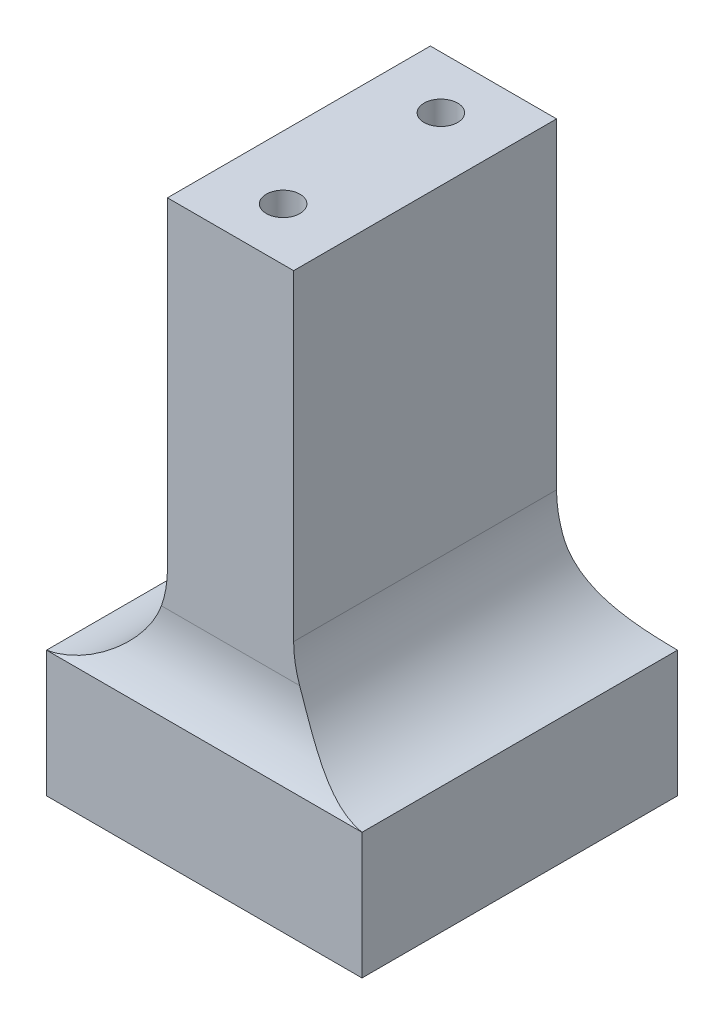
ISO-10303-21;
HEADER;
FILE_DESCRIPTION(('STEP AP214'),'2;1');
FILE_NAME('part.step','',(''),(''),'','','');
FILE_SCHEMA(('AUTOMOTIVE_DESIGN { 1 0 10303 214 1 1 1 1 }'));
ENDSEC;
DATA;
#1=APPLICATION_CONTEXT('core data for automotive mechanical design processes');
#2=APPLICATION_PROTOCOL_DEFINITION('international standard','automotive_design',2000,#1);
#3=PRODUCT_CONTEXT('',#1,'mechanical');
#4=PRODUCT('Part','Part','',(#3));
#5=PRODUCT_RELATED_PRODUCT_CATEGORY('part','',(#4));
#6=PRODUCT_DEFINITION_FORMATION('','',#4);
#7=PRODUCT_DEFINITION_CONTEXT('part definition',#1,'design');
#8=PRODUCT_DEFINITION('design','',#6,#7);
#9=PRODUCT_DEFINITION_SHAPE('','',#8);
#10=(LENGTH_UNIT() NAMED_UNIT(*) SI_UNIT(.MILLI.,.METRE.));
#11=(NAMED_UNIT(*) PLANE_ANGLE_UNIT() SI_UNIT($,.RADIAN.));
#12=(NAMED_UNIT(*) SI_UNIT($,.STERADIAN.) SOLID_ANGLE_UNIT());
#13=UNCERTAINTY_MEASURE_WITH_UNIT(LENGTH_MEASURE(1.E-05),#10,'distance_accuracy_value','');
#14=(GEOMETRIC_REPRESENTATION_CONTEXT(3) GLOBAL_UNCERTAINTY_ASSIGNED_CONTEXT((#13)) GLOBAL_UNIT_ASSIGNED_CONTEXT((#10,
#11,#12)) REPRESENTATION_CONTEXT('',''));
#15=CARTESIAN_POINT('',(0.,0.,0.));
#16=DIRECTION('',(0.,0.,1.));
#17=DIRECTION('',(1.,0.,0.));
#18=AXIS2_PLACEMENT_3D('',#15,#16,#17);
#19=CARTESIAN_POINT('',(-15.,12.,15.));
#20=DIRECTION('',(1.,0.,0.));
#21=DIRECTION('',(0.,0.,-1.));
#22=AXIS2_PLACEMENT_3D('',#19,#20,#21);
#23=PLANE('',#22);
#24=DIRECTION('',(0.,0.,1.));
#25=VECTOR('',#24,1.);
#26=CARTESIAN_POINT('',(-15.,0.,15.));
#27=LINE('',#26,#25);
#28=CARTESIAN_POINT('',(-15.,0.,-15.));
#29=VERTEX_POINT('',#28);
#30=CARTESIAN_POINT('',(-15.,0.,15.));
#31=VERTEX_POINT('',#30);
#32=EDGE_CURVE('E148',#29,#31,#27,.T.);
#33=ORIENTED_EDGE('',*,*,#32,.T.);
#34=DIRECTION('',(0.,-1.,0.));
#35=VECTOR('',#34,1.);
#36=CARTESIAN_POINT('',(-15.,12.,15.));
#37=LINE('',#36,#35);
#38=CARTESIAN_POINT('',(-15.,12.,15.));
#39=VERTEX_POINT('',#38);
#40=EDGE_CURVE('E182',#39,#31,#37,.T.);
#41=ORIENTED_EDGE('',*,*,#40,.F.);
#42=DIRECTION('',(0.,0.,1.));
#43=VECTOR('',#42,1.);
#44=CARTESIAN_POINT('',(-15.,12.,15.));
#45=LINE('',#44,#43);
#46=CARTESIAN_POINT('',(-15.,12.,-15.));
#47=VERTEX_POINT('',#46);
#48=EDGE_CURVE('E154',#47,#39,#45,.T.);
#49=ORIENTED_EDGE('',*,*,#48,.F.);
#50=DIRECTION('',(0.,-1.,0.));
#51=VECTOR('',#50,1.);
#52=CARTESIAN_POINT('',(-15.,12.,-15.));
#53=LINE('',#52,#51);
#54=EDGE_CURVE('E170',#47,#29,#53,.T.);
#55=ORIENTED_EDGE('',*,*,#54,.T.);
#56=EDGE_LOOP('',(#33,#41,#49,#55));
#57=FACE_BOUND('',#56,.T.);
#58=ADVANCED_FACE('F39',(#57),#23,.F.);
#59=CARTESIAN_POINT('',(15.,12.,15.));
#60=DIRECTION('',(0.,0.,-1.));
#61=DIRECTION('',(-1.,0.,0.));
#62=AXIS2_PLACEMENT_3D('',#59,#60,#61);
#63=PLANE('',#62);
#64=DIRECTION('',(1.,0.,0.));
#65=VECTOR('',#64,1.);
#66=CARTESIAN_POINT('',(15.,0.,15.));
#67=LINE('',#66,#65);
#68=CARTESIAN_POINT('',(15.,0.,15.));
#69=VERTEX_POINT('',#68);
#70=EDGE_CURVE('E149',#31,#69,#67,.T.);
#71=ORIENTED_EDGE('',*,*,#70,.T.);
#72=DIRECTION('',(0.,-1.,0.));
#73=VECTOR('',#72,1.);
#74=CARTESIAN_POINT('',(15.,12.,15.));
#75=LINE('',#74,#73);
#76=CARTESIAN_POINT('',(15.,12.,15.));
#77=VERTEX_POINT('',#76);
#78=EDGE_CURVE('E179',#77,#69,#75,.T.);
#79=ORIENTED_EDGE('',*,*,#78,.F.);
#80=DIRECTION('',(1.,0.,0.));
#81=VECTOR('',#80,1.);
#82=CARTESIAN_POINT('',(15.,12.,15.));
#83=LINE('',#82,#81);
#84=EDGE_CURVE('E158',#39,#77,#83,.T.);
#85=ORIENTED_EDGE('',*,*,#84,.F.);
#86=ORIENTED_EDGE('',*,*,#40,.T.);
#87=EDGE_LOOP('',(#71,#79,#85,#86));
#88=FACE_BOUND('',#87,.T.);
#89=ADVANCED_FACE('F226',(#88),#63,.F.);
#90=CARTESIAN_POINT('',(15.,12.,15.));
#91=DIRECTION('',(-1.,0.,0.));
#92=DIRECTION('',(0.,0.,1.));
#93=AXIS2_PLACEMENT_3D('',#90,#91,#92);
#94=PLANE('',#93);
#95=DIRECTION('',(0.,0.,-1.));
#96=VECTOR('',#95,1.);
#97=CARTESIAN_POINT('',(15.,0.,15.));
#98=LINE('',#97,#96);
#99=CARTESIAN_POINT('',(15.,0.,-15.));
#100=VERTEX_POINT('',#99);
#101=EDGE_CURVE('E168',#69,#100,#98,.T.);
#102=ORIENTED_EDGE('',*,*,#101,.T.);
#103=DIRECTION('',(0.,-1.,0.));
#104=VECTOR('',#103,1.);
#105=CARTESIAN_POINT('',(15.,12.,-15.));
#106=LINE('',#105,#104);
#107=CARTESIAN_POINT('',(15.,12.,-15.));
#108=VERTEX_POINT('',#107);
#109=EDGE_CURVE('E171',#108,#100,#106,.T.);
#110=ORIENTED_EDGE('',*,*,#109,.F.);
#111=DIRECTION('',(0.,0.,-1.));
#112=VECTOR('',#111,1.);
#113=CARTESIAN_POINT('',(15.,12.,15.));
#114=LINE('',#113,#112);
#115=EDGE_CURVE('E165',#77,#108,#114,.T.);
#116=ORIENTED_EDGE('',*,*,#115,.F.);
#117=ORIENTED_EDGE('',*,*,#78,.T.);
#118=EDGE_LOOP('',(#102,#110,#116,#117));
#119=FACE_BOUND('',#118,.T.);
#120=ADVANCED_FACE('F237',(#119),#94,.F.);
#121=CARTESIAN_POINT('',(15.,12.,-15.));
#122=DIRECTION('',(0.,0.,1.));
#123=DIRECTION('',(1.,0.,0.));
#124=AXIS2_PLACEMENT_3D('',#121,#122,#123);
#125=PLANE('',#124);
#126=DIRECTION('',(-1.,0.,0.));
#127=VECTOR('',#126,1.);
#128=CARTESIAN_POINT('',(15.,0.,-15.));
#129=LINE('',#128,#127);
#130=EDGE_CURVE('E157',#100,#29,#129,.T.);
#131=ORIENTED_EDGE('',*,*,#130,.T.);
#132=ORIENTED_EDGE('',*,*,#54,.F.);
#133=DIRECTION('',(-1.,0.,0.));
#134=VECTOR('',#133,1.);
#135=CARTESIAN_POINT('',(15.,12.,-15.));
#136=LINE('',#135,#134);
#137=EDGE_CURVE('E164',#108,#47,#136,.T.);
#138=ORIENTED_EDGE('',*,*,#137,.F.);
#139=ORIENTED_EDGE('',*,*,#109,.T.);
#140=EDGE_LOOP('',(#131,#132,#138,#139));
#141=FACE_BOUND('',#140,.T.);
#142=ADVANCED_FACE('F244',(#141),#125,.F.);
#143=CARTESIAN_POINT('',(0.,0.,0.));
#144=DIRECTION('',(0.,1.,0.));
#145=DIRECTION('',(0.,0.,1.));
#146=AXIS2_PLACEMENT_3D('',#143,#144,#145);
#147=PLANE('',#146);
#148=ORIENTED_EDGE('',*,*,#32,.F.);
#149=ORIENTED_EDGE('',*,*,#130,.F.);
#150=ORIENTED_EDGE('',*,*,#101,.F.);
#151=ORIENTED_EDGE('',*,*,#70,.F.);
#152=EDGE_LOOP('',(#148,#149,#150,#151));
#153=FACE_BOUND('',#152,.T.);
#154=ADVANCED_FACE('F247',(#153),#147,.F.);
#155=CARTESIAN_POINT('',(6.,52.5,-12.5));
#156=DIRECTION('',(-1.,0.,0.));
#157=DIRECTION('',(0.,0.,1.));
#158=AXIS2_PLACEMENT_3D('',#155,#156,#157);
#159=PLANE('',#158);
#160=DIRECTION('',(0.,-1.,0.));
#161=VECTOR('',#160,1.);
#162=CARTESIAN_POINT('',(6.,52.5,12.5));
#163=LINE('',#162,#161);
#164=CARTESIAN_POINT('',(6.,52.5,12.5));
#165=VERTEX_POINT('',#164);
#166=CARTESIAN_POINT('',(6.,21.9498743710662,12.5));
#167=VERTEX_POINT('',#166);
#168=EDGE_CURVE('E293',#165,#167,#163,.T.);
#169=ORIENTED_EDGE('',*,*,#168,.T.);
#170=DIRECTION('',(0.,0.,1.));
#171=VECTOR('',#170,1.);
#172=CARTESIAN_POINT('',(6.,21.9498743710662,-12.5));
#173=LINE('',#172,#171);
#174=CARTESIAN_POINT('',(6.,21.9498743710662,-12.5));
#175=VERTEX_POINT('',#174);
#176=EDGE_CURVE('E144',#167,#175,#173,.F.);
#177=ORIENTED_EDGE('',*,*,#176,.T.);
#178=DIRECTION('',(0.,-1.,0.));
#179=VECTOR('',#178,1.);
#180=CARTESIAN_POINT('',(6.,52.5,-12.5));
#181=LINE('',#180,#179);
#182=CARTESIAN_POINT('',(6.,52.5,-12.5));
#183=VERTEX_POINT('',#182);
#184=EDGE_CURVE('E123',#183,#175,#181,.T.);
#185=ORIENTED_EDGE('',*,*,#184,.F.);
#186=DIRECTION('',(0.,0.,-1.));
#187=VECTOR('',#186,1.);
#188=CARTESIAN_POINT('',(6.,52.5,-12.5));
#189=LINE('',#188,#187);
#190=EDGE_CURVE('E134',#165,#183,#189,.T.);
#191=ORIENTED_EDGE('',*,*,#190,.F.);
#192=EDGE_LOOP('',(#169,#177,#185,#191));
#193=FACE_BOUND('',#192,.T.);
#194=ADVANCED_FACE('F141',(#193),#159,.F.);
#195=CARTESIAN_POINT('',(6.,52.5,-12.5));
#196=DIRECTION('',(0.,0.,1.));
#197=DIRECTION('',(1.,0.,0.));
#198=AXIS2_PLACEMENT_3D('',#195,#196,#197);
#199=PLANE('',#198);
#200=ORIENTED_EDGE('',*,*,#184,.T.);
#201=CARTESIAN_POINT('',(16.,21.9498743710662,-12.5));
#202=DIRECTION('',(0.,0.,1.));
#203=DIRECTION('',(1.,0.,0.));
#204=AXIS2_PLACEMENT_3D('',#201,#202,#203);
#205=CIRCLE('',#204,10.);
#206=CARTESIAN_POINT('',(6.57267451442978,18.6143782776615,-12.5));
#207=VERTEX_POINT('',#206);
#208=EDGE_CURVE('E52',#175,#207,#205,.T.);
#209=ORIENTED_EDGE('',*,*,#208,.T.);
#210=DIRECTION('',(1.,0.,0.));
#211=VECTOR('',#210,1.);
#212=CARTESIAN_POINT('',(6.,18.6143782776615,-12.5));
#213=LINE('',#212,#211);
#214=CARTESIAN_POINT('',(-6.57267451442978,18.6143782776615,-12.5));
#215=VERTEX_POINT('',#214);
#216=EDGE_CURVE('E184',#207,#215,#213,.F.);
#217=ORIENTED_EDGE('',*,*,#216,.T.);
#218=CARTESIAN_POINT('',(-16.,21.9498743710662,-12.5));
#219=DIRECTION('',(0.,0.,1.));
#220=DIRECTION('',(1.,0.,0.));
#221=AXIS2_PLACEMENT_3D('',#218,#219,#220);
#222=CIRCLE('',#221,10.);
#223=CARTESIAN_POINT('',(-6.,21.9498743710662,-12.5));
#224=VERTEX_POINT('',#223);
#225=EDGE_CURVE('E195',#215,#224,#222,.T.);
#226=ORIENTED_EDGE('',*,*,#225,.T.);
#227=DIRECTION('',(0.,-1.,0.));
#228=VECTOR('',#227,1.);
#229=CARTESIAN_POINT('',(-6.,52.5,-12.5));
#230=LINE('',#229,#228);
#231=CARTESIAN_POINT('',(-6.,52.5,-12.5));
#232=VERTEX_POINT('',#231);
#233=EDGE_CURVE('E126',#232,#224,#230,.T.);
#234=ORIENTED_EDGE('',*,*,#233,.F.);
#235=DIRECTION('',(-1.,0.,0.));
#236=VECTOR('',#235,1.);
#237=CARTESIAN_POINT('',(6.,52.5,-12.5));
#238=LINE('',#237,#236);
#239=EDGE_CURVE('E116',#183,#232,#238,.T.);
#240=ORIENTED_EDGE('',*,*,#239,.F.);
#241=EDGE_LOOP('',(#200,#209,#217,#226,#234,#240));
#242=FACE_BOUND('',#241,.T.);
#243=ADVANCED_FACE('F125',(#242),#199,.F.);
#244=CARTESIAN_POINT('',(-6.,52.5,-12.5));
#245=DIRECTION('',(1.,0.,0.));
#246=DIRECTION('',(0.,0.,-1.));
#247=AXIS2_PLACEMENT_3D('',#244,#245,#246);
#248=PLANE('',#247);
#249=ORIENTED_EDGE('',*,*,#233,.T.);
#250=DIRECTION('',(0.,0.,-1.));
#251=VECTOR('',#250,1.);
#252=CARTESIAN_POINT('',(-6.,21.9498743710662,-12.5));
#253=LINE('',#252,#251);
#254=CARTESIAN_POINT('',(-6.,21.9498743710662,12.5));
#255=VERTEX_POINT('',#254);
#256=EDGE_CURVE('E188',#224,#255,#253,.F.);
#257=ORIENTED_EDGE('',*,*,#256,.T.);
#258=DIRECTION('',(0.,-1.,0.));
#259=VECTOR('',#258,1.);
#260=CARTESIAN_POINT('',(-6.,52.5,12.5));
#261=LINE('',#260,#259);
#262=CARTESIAN_POINT('',(-6.,52.5,12.5));
#263=VERTEX_POINT('',#262);
#264=EDGE_CURVE('E151',#263,#255,#261,.T.);
#265=ORIENTED_EDGE('',*,*,#264,.F.);
#266=DIRECTION('',(0.,0.,1.));
#267=VECTOR('',#266,1.);
#268=CARTESIAN_POINT('',(-6.,52.5,-12.5));
#269=LINE('',#268,#267);
#270=EDGE_CURVE('E133',#232,#263,#269,.T.);
#271=ORIENTED_EDGE('',*,*,#270,.F.);
#272=EDGE_LOOP('',(#249,#257,#265,#271));
#273=FACE_BOUND('',#272,.T.);
#274=ADVANCED_FACE('F254',(#273),#248,.F.);
#275=CARTESIAN_POINT('',(6.,52.5,12.5));
#276=DIRECTION('',(0.,0.,-1.));
#277=DIRECTION('',(-1.,0.,0.));
#278=AXIS2_PLACEMENT_3D('',#275,#276,#277);
#279=PLANE('',#278);
#280=CARTESIAN_POINT('',(-16.,21.9498743710662,12.5));
#281=DIRECTION('',(0.,0.,-1.));
#282=DIRECTION('',(-1.,0.,0.));
#283=AXIS2_PLACEMENT_3D('',#280,#281,#282);
#284=CIRCLE('',#283,10.);
#285=CARTESIAN_POINT('',(-6.57267451442978,18.6143782776615,12.5));
#286=VERTEX_POINT('',#285);
#287=EDGE_CURVE('E186',#255,#286,#284,.T.);
#288=ORIENTED_EDGE('',*,*,#287,.T.);
#289=DIRECTION('',(-1.,0.,0.));
#290=VECTOR('',#289,1.);
#291=CARTESIAN_POINT('',(6.,18.6143782776615,12.5));
#292=LINE('',#291,#290);
#293=CARTESIAN_POINT('',(6.57267451442978,18.6143782776615,12.5));
#294=VERTEX_POINT('',#293);
#295=EDGE_CURVE('E58',#286,#294,#292,.F.);
#296=ORIENTED_EDGE('',*,*,#295,.T.);
#297=CARTESIAN_POINT('',(16.,21.9498743710662,12.5));
#298=DIRECTION('',(0.,0.,-1.));
#299=DIRECTION('',(-1.,0.,0.));
#300=AXIS2_PLACEMENT_3D('',#297,#298,#299);
#301=CIRCLE('',#300,10.);
#302=EDGE_CURVE('E11',#294,#167,#301,.T.);
#303=ORIENTED_EDGE('',*,*,#302,.T.);
#304=ORIENTED_EDGE('',*,*,#168,.F.);
#305=DIRECTION('',(1.,0.,0.));
#306=VECTOR('',#305,1.);
#307=CARTESIAN_POINT('',(6.,52.5,12.5));
#308=LINE('',#307,#306);
#309=EDGE_CURVE('E140',#263,#165,#308,.T.);
#310=ORIENTED_EDGE('',*,*,#309,.F.);
#311=ORIENTED_EDGE('',*,*,#264,.T.);
#312=EDGE_LOOP('',(#288,#296,#303,#304,#310,#311));
#313=FACE_BOUND('',#312,.T.);
#314=ADVANCED_FACE('F256',(#313),#279,.F.);
#315=CARTESIAN_POINT('',(0.,52.5,0.));
#316=DIRECTION('',(0.,-1.,0.));
#317=DIRECTION('',(0.,0.,-1.));
#318=AXIS2_PLACEMENT_3D('',#315,#316,#317);
#319=PLANE('',#318);
#320=CARTESIAN_POINT('',(0.,52.5,7.50000000000001));
#321=DIRECTION('',(0.,1.,0.));
#322=DIRECTION('',(0.,0.,1.));
#323=AXIS2_PLACEMENT_3D('',#320,#321,#322);
#324=CIRCLE('',#323,1.6);
#325=CARTESIAN_POINT('',(0.,52.5,9.1));
#326=VERTEX_POINT('',#325);
#327=EDGE_CURVE('E284',#326,#326,#324,.T.);
#328=ORIENTED_EDGE('',*,*,#327,.F.);
#329=EDGE_LOOP('',(#328));
#330=FACE_BOUND('',#329,.T.);
#331=CARTESIAN_POINT('',(0.,52.5,-7.49999999999999));
#332=DIRECTION('',(0.,1.,0.));
#333=DIRECTION('',(0.,0.,1.));
#334=AXIS2_PLACEMENT_3D('',#331,#332,#333);
#335=CIRCLE('',#334,1.6);
#336=CARTESIAN_POINT('',(0.,52.5,-5.89999999999999));
#337=VERTEX_POINT('',#336);
#338=EDGE_CURVE('E281',#337,#337,#335,.T.);
#339=ORIENTED_EDGE('',*,*,#338,.F.);
#340=EDGE_LOOP('',(#339));
#341=FACE_BOUND('',#340,.T.);
#342=ORIENTED_EDGE('',*,*,#190,.T.);
#343=ORIENTED_EDGE('',*,*,#239,.T.);
#344=ORIENTED_EDGE('',*,*,#270,.T.);
#345=ORIENTED_EDGE('',*,*,#309,.T.);
#346=EDGE_LOOP('',(#342,#343,#344,#345));
#347=FACE_BOUND('',#346,.T.);
#348=ADVANCED_FACE('F131',(#330,#341,#347),#319,.F.);
#349=CARTESIAN_POINT('',(0.,42.5,-7.49999999999999));
#350=DIRECTION('',(0.,1.,0.));
#351=DIRECTION('',(0.,0.,1.));
#352=AXIS2_PLACEMENT_3D('',#349,#350,#351);
#353=CYLINDRICAL_SURFACE('',#352,1.6);
#354=CARTESIAN_POINT('',(0.,42.5,-7.49999999999999));
#355=DIRECTION('',(0.,1.,0.));
#356=DIRECTION('',(0.,0.,1.));
#357=AXIS2_PLACEMENT_3D('',#354,#355,#356);
#358=CIRCLE('',#357,1.6);
#359=CARTESIAN_POINT('',(0.,42.5,-5.89999999999999));
#360=VERTEX_POINT('',#359);
#361=EDGE_CURVE('E288',#360,#360,#358,.T.);
#362=ORIENTED_EDGE('',*,*,#361,.F.);
#363=EDGE_LOOP('',(#362));
#364=FACE_BOUND('',#363,.T.);
#365=ORIENTED_EDGE('',*,*,#338,.T.);
#366=EDGE_LOOP('',(#365));
#367=FACE_BOUND('',#366,.T.);
#368=ADVANCED_FACE('F262',(#364,#367),#353,.F.);
#369=CARTESIAN_POINT('',(0.,42.5,-7.49999999999999));
#370=DIRECTION('',(0.,1.,0.));
#371=DIRECTION('',(0.,0.,1.));
#372=AXIS2_PLACEMENT_3D('',#369,#370,#371);
#373=PLANE('',#372);
#374=ORIENTED_EDGE('',*,*,#361,.T.);
#375=EDGE_LOOP('',(#374));
#376=FACE_BOUND('',#375,.T.);
#377=ADVANCED_FACE('F266',(#376),#373,.T.);
#378=CARTESIAN_POINT('',(0.,42.5,7.50000000000001));
#379=DIRECTION('',(0.,1.,0.));
#380=DIRECTION('',(0.,0.,1.));
#381=AXIS2_PLACEMENT_3D('',#378,#379,#380);
#382=CYLINDRICAL_SURFACE('',#381,1.6);
#383=CARTESIAN_POINT('',(0.,42.5,7.50000000000001));
#384=DIRECTION('',(0.,1.,0.));
#385=DIRECTION('',(0.,0.,1.));
#386=AXIS2_PLACEMENT_3D('',#383,#384,#385);
#387=CIRCLE('',#386,1.6);
#388=CARTESIAN_POINT('',(0.,42.5,9.1));
#389=VERTEX_POINT('',#388);
#390=EDGE_CURVE('E143',#389,#389,#387,.T.);
#391=ORIENTED_EDGE('',*,*,#390,.F.);
#392=EDGE_LOOP('',(#391));
#393=FACE_BOUND('',#392,.T.);
#394=ORIENTED_EDGE('',*,*,#327,.T.);
#395=EDGE_LOOP('',(#394));
#396=FACE_BOUND('',#395,.T.);
#397=ADVANCED_FACE('F267',(#393,#396),#382,.F.);
#398=CARTESIAN_POINT('',(0.,42.5,7.50000000000001));
#399=DIRECTION('',(0.,1.,0.));
#400=DIRECTION('',(0.,0.,1.));
#401=AXIS2_PLACEMENT_3D('',#398,#399,#400);
#402=PLANE('',#401);
#403=ORIENTED_EDGE('',*,*,#390,.T.);
#404=EDGE_LOOP('',(#403));
#405=FACE_BOUND('',#404,.T.);
#406=ADVANCED_FACE('F229',(#405),#402,.T.);
#407=CARTESIAN_POINT('',(0.,18.6143782776615,22.5));
#408=DIRECTION('',(-1.,0.,0.));
#409=DIRECTION('',(0.,0.,1.));
#410=AXIS2_PLACEMENT_3D('',#407,#408,#409);
#411=CYLINDRICAL_SURFACE('',#410,10.);
#412=CARTESIAN_POINT('',(-6.57267451442978,18.6143782776615,12.5));
#413=CARTESIAN_POINT('',(-6.61484080346284,18.4951948277681,12.4999981864453));
#414=CARTESIAN_POINT('',(-6.65926311915033,18.3768366796971,12.502131142787));
#415=CARTESIAN_POINT('',(-6.75249933064394,18.1420296775869,12.5104714301112));
#416=CARTESIAN_POINT('',(-6.8013125163324,18.025580518403,12.5166781032868));
#417=CARTESIAN_POINT('',(-6.9540149196071,17.6797992093009,12.5410908505895));
#418=CARTESIAN_POINT('',(-7.06430371173649,17.4536473579843,12.5650909230125));
#419=CARTESIAN_POINT('',(-7.29952588174575,17.0139490123931,12.6264260882361));
#420=CARTESIAN_POINT('',(-7.42430606041553,16.8003011485263,12.6636289404709));
#421=CARTESIAN_POINT('',(-7.68819245936962,16.3843977213723,12.749497969225));
#422=CARTESIAN_POINT('',(-7.82730330965793,16.1821458728045,12.7981678571327));
#423=CARTESIAN_POINT('',(-8.11785385563891,15.7910768318167,12.9046985413966));
#424=CARTESIAN_POINT('',(-8.26922200398623,15.6021922469472,12.9625076449781));
#425=CARTESIAN_POINT('',(-8.58384157688787,15.2372993342789,13.0855190254443));
#426=CARTESIAN_POINT('',(-8.74709207345986,15.0612900031022,13.1507207252067));
#427=CARTESIAN_POINT('',(-9.25471231751441,14.5518075674992,13.3550838434677));
#428=CARTESIAN_POINT('',(-9.61600789956289,14.2381401084519,13.5026371219133));
#429=CARTESIAN_POINT('',(-10.2150754811526,13.7884135875026,13.7396002600494));
#430=CARTESIAN_POINT('',(-10.4399733964408,13.6335817847618,13.8270279936906));
#431=CARTESIAN_POINT('',(-10.9021015765098,13.3425552242208,14.0007912355777));
#432=CARTESIAN_POINT('',(-11.1393342455471,13.2063641187484,14.0871265267793));
#433=CARTESIAN_POINT('',(-11.6245905782187,12.9537421250145,14.2549930435805));
#434=CARTESIAN_POINT('',(-11.8725748062497,12.8372456205961,14.336539606263));
#435=CARTESIAN_POINT('',(-12.3794159757468,12.624272371002,14.4915063810517));
#436=CARTESIAN_POINT('',(-12.638268549713,12.5277876748347,14.5649298151677));
#437=CARTESIAN_POINT('',(-13.0696864012641,12.3872201959955,14.6752106753392));
#438=CARTESIAN_POINT('',(-13.2393156661237,12.3368552863884,14.7156419326572));
#439=CARTESIAN_POINT('',(-13.5821758864122,12.2449471294413,14.790664156351));
#440=CARTESIAN_POINT('',(-13.7554055984308,12.203400890387,14.8252571025423));
#441=CARTESIAN_POINT('',(-14.1057057396666,12.1292938847481,14.8877683491864));
#442=CARTESIAN_POINT('',(-14.2827884909961,12.0967687117289,14.915660153303));
#443=CARTESIAN_POINT('',(-14.6396075890835,12.0411897711945,14.963790725322));
#444=CARTESIAN_POINT('',(-14.8193459983393,12.0181438147572,14.9840231806682));
#445=CARTESIAN_POINT('',(-15.,12.,15.));
#446=B_SPLINE_CURVE_WITH_KNOTS('',3,(#412,#413,#414,#415,#416,#417,#418,#419,#420,#421,#422,
#423,#424,#425,#426,#427,#428,#429,#430,#431,#432,#433,#434,#435,#436,#437,#438,#439,#440,#441,
#442,#443,#444,#445),.UNSPECIFIED.,.F.,.F.,(4,2,2,2,2,2,2,2,2,2,2,2,2,2,2,2,4),(0.,
0.379180025901376,0.758298838425357,1.51531370497807,2.26495082410035,3.01483090276707,
3.76061204813886,4.50633501219329,6.00258284387667,6.86200876967007,7.72160284504671,
8.57827403641399,9.43460420467824,9.97883117178507,10.5228732149738,11.0690322477159,
11.6156404299363),.UNSPECIFIED.);
#447=EDGE_CURVE('E305',#39,#286,#446,.F.);
#448=ORIENTED_EDGE('',*,*,#447,.F.);
#449=ORIENTED_EDGE('',*,*,#84,.T.);
#450=CARTESIAN_POINT('',(8.08485336837531,28.0613761341259,25.7793644963554));
#451=CARTESIAN_POINT('',(8.14013685952824,28.1329506617224,25.5732135494816));
#452=CARTESIAN_POINT('',(8.19195471715747,28.1980737239282,25.3637908051321));
#453=CARTESIAN_POINT('',(8.28685437358527,28.314867831794,24.9390583161418));
#454=CARTESIAN_POINT('',(8.32992692845817,28.3665246596299,24.7237426124581));
#455=CARTESIAN_POINT('',(8.40534531150326,28.4556111086889,24.2886745096938));
#456=CARTESIAN_POINT('',(8.4377085863993,28.4930638847366,24.0689299516927));
#457=CARTESIAN_POINT('',(8.49023573792543,28.5532866121055,23.6260599156194));
#458=CARTESIAN_POINT('',(8.51040424294925,28.5760621342369,23.4029357532398));
#459=CARTESIAN_POINT('',(8.53757539373705,28.6066488964749,22.9534206570572));
#460=CARTESIAN_POINT('',(8.54449368195454,28.614364261967,22.7270179780846));
#461=CARTESIAN_POINT('',(8.54451870044347,28.6143922567871,22.2741917425295));
#462=CARTESIAN_POINT('',(8.53762419513633,28.60670350819,22.0477681858911));
#463=CARTESIAN_POINT('',(8.51042471145378,28.5760854927027,21.5970236345634));
#464=CARTESIAN_POINT('',(8.49013408739531,28.5531725388074,21.3727006497006));
#465=CARTESIAN_POINT('',(8.43724538725841,28.4925303532723,20.9275516046367));
#466=CARTESIAN_POINT('',(8.40464620449768,28.4547997893451,20.7067258607391));
#467=CARTESIAN_POINT('',(8.32223019203026,28.3574156469111,20.2325366143558));
#468=CARTESIAN_POINT('',(8.270422891776,28.2951172767062,19.9800626806503));
#469=CARTESIAN_POINT('',(8.15509840166251,28.151966362867,19.4831599067901));
#470=CARTESIAN_POINT('',(8.09157726893048,28.0711075695497,19.2387338082809));
#471=CARTESIAN_POINT('',(7.95579273096486,27.8915428185957,18.7583223593942));
#472=CARTESIAN_POINT('',(7.88350750993941,27.7927920089293,18.5223600487256));
#473=CARTESIAN_POINT('',(7.73335421582079,27.5783463741311,18.0601592345518));
#474=CARTESIAN_POINT('',(7.65548639065902,27.4626523012361,17.8339202999306));
#475=CARTESIAN_POINT('',(7.49542089749951,27.2124425234043,17.3872604448409));
#476=CARTESIAN_POINT('',(7.41316813077417,27.0776006995621,17.1670421805146));
#477=CARTESIAN_POINT('',(7.24856366774258,26.7913233231872,16.7376963689354));
#478=CARTESIAN_POINT('',(7.16621196779858,26.6398871407864,16.5285692431134));
#479=CARTESIAN_POINT('',(7.00413308410672,26.3209544972051,16.1222810270772));
#480=CARTESIAN_POINT('',(6.92440296191392,26.1534769022207,15.9251063149286));
#481=CARTESIAN_POINT('',(6.77000792770201,25.8026610635929,15.5432922722733));
#482=CARTESIAN_POINT('',(6.69534231753975,25.6193250139981,15.3586512139993));
#483=CARTESIAN_POINT('',(6.56015334039675,25.2549426212047,15.0194263861154));
#484=CARTESIAN_POINT('',(6.49896058834364,25.0752618989629,14.8636432992564));
#485=CARTESIAN_POINT('',(6.38470104258017,24.703739123549,14.5642224911894));
#486=CARTESIAN_POINT('',(6.33163004269284,24.5119034386048,14.4205785006393));
#487=CARTESIAN_POINT('',(6.23544403831708,24.1166284757944,14.1463718192504));
#488=CARTESIAN_POINT('',(6.19233124351776,23.9131866350294,14.0158120353804));
#489=CARTESIAN_POINT('',(6.11793151768616,23.495728314066,13.768951251807));
#490=CARTESIAN_POINT('',(6.08664437013104,23.2817120275626,13.652649991062));
#491=CARTESIAN_POINT('',(6.03742756553865,22.8423316341531,13.4343973590686));
#492=CARTESIAN_POINT('',(6.01963091001222,22.6168773379441,13.3325967073788));
#493=CARTESIAN_POINT('',(5.9995416866144,22.1583919784178,13.145790372945));
#494=CARTESIAN_POINT('',(5.99725027742399,21.9253603501667,13.0607859458155));
#495=CARTESIAN_POINT('',(6.00951056365489,21.4543997735485,12.9085767727461));
#496=CARTESIAN_POINT('',(6.02403336383948,21.2164799149156,12.8413417336769));
#497=CARTESIAN_POINT('',(6.07078604591768,20.7380732912827,12.7250058558067));
#498=CARTESIAN_POINT('',(6.10300817496407,20.4975876953476,12.6758970928786));
#499=CARTESIAN_POINT('',(6.19183881594867,19.9804246356493,12.5897756710042));
#500=CARTESIAN_POINT('',(6.25139056882008,19.7037545867321,12.5557011668469));
#501=CARTESIAN_POINT('',(6.39437197815065,19.1548144707798,12.5108166675737));
#502=CARTESIAN_POINT('',(6.47779775434584,18.8825436963182,12.5000028943033));
#503=CARTESIAN_POINT('',(6.65639168198953,18.3777550069306,12.4999974461304));
#504=CARTESIAN_POINT('',(6.7490244821734,18.1443281291475,12.5084121449748));
#505=CARTESIAN_POINT('',(6.9511773703375,17.6858860679126,12.5405457947863));
#506=CARTESIAN_POINT('',(7.0607056819163,17.4608750473548,12.5642722164702));
#507=CARTESIAN_POINT('',(7.29562660099311,17.0207534078861,12.6252939819973));
#508=CARTESIAN_POINT('',(7.42104630497816,16.8056605756671,12.6626127108299));
#509=CARTESIAN_POINT('',(7.68641589273743,16.386979937374,12.7488761839288));
#510=CARTESIAN_POINT('',(7.82637287427553,16.1833978269845,12.7978266224895));
#511=CARTESIAN_POINT('',(8.11810965490034,15.7907329062598,12.9047924190501));
#512=CARTESIAN_POINT('',(8.26975674465592,15.6015251152649,12.9627118993995));
#513=CARTESIAN_POINT('',(8.58497460587191,15.2360324810781,13.0859668838603));
#514=CARTESIAN_POINT('',(8.74854445158571,15.0597466366843,13.1513018124155));
#515=CARTESIAN_POINT('',(9.25598494403366,14.5507028136588,13.3556033291832));
#516=CARTESIAN_POINT('',(9.61667715948335,14.2376375172342,13.5029018457457));
#517=CARTESIAN_POINT('',(10.2147364269953,13.788668217111,13.7394661484342));
#518=CARTESIAN_POINT('',(10.4392761755097,13.6340620234056,13.8267568882844));
#519=CARTESIAN_POINT('',(10.9006442686078,13.3434320272782,14.0002521943555));
#520=CARTESIAN_POINT('',(11.1374747348929,13.207411448044,14.0864565698277));
#521=CARTESIAN_POINT('',(11.6225895118524,12.9547053420802,14.2543272333404));
#522=CARTESIAN_POINT('',(11.8708674516842,12.8380092228945,14.3359959910955));
#523=CARTESIAN_POINT('',(12.3784542329993,12.6246305907319,14.4912337814957));
#524=CARTESIAN_POINT('',(12.6377649010764,12.5279514074522,14.5648014656245));
#525=CARTESIAN_POINT('',(13.110786024197,12.3738291311136,14.6857164230032));
#526=CARTESIAN_POINT('',(13.3226266208846,12.3124102363072,14.7353248849639));
#527=CARTESIAN_POINT('',(13.751694825021,12.2033840377456,14.8250964278371));
#528=CARTESIAN_POINT('',(13.9689191178218,12.1557684541,14.8652651683991));
#529=CARTESIAN_POINT('',(14.4074408636021,12.0749886211975,14.9343397879101));
#530=CARTESIAN_POINT('',(14.6287308094533,12.0418000760452,14.9632645934822));
#531=CARTESIAN_POINT('',(15.0743314959212,11.9902845550835,15.0085003088988));
#532=CARTESIAN_POINT('',(15.2986421857958,11.971957329952,15.0248114303573));
#533=CARTESIAN_POINT('',(15.7496080255827,11.9504499135751,15.0439773644213));
#534=CARTESIAN_POINT('',(15.9762692110333,11.9473396476741,15.0467700561861));
#535=CARTESIAN_POINT('',(16.4290214697495,11.9565160295307,15.0385721654121));
#536=CARTESIAN_POINT('',(16.6551125487391,11.9688025220781,15.0275817218171));
#537=CARTESIAN_POINT('',(17.1051826139728,12.0085628026301,14.9924105868095));
#538=CARTESIAN_POINT('',(17.3291586787196,12.036055147667,14.9682137789926));
#539=CARTESIAN_POINT('',(17.7731674344388,12.1057692932152,14.907890960911));
#540=CARTESIAN_POINT('',(17.9931996048028,12.1479930234863,14.8717633877911));
#541=CARTESIAN_POINT('',(18.4698255180103,12.2560322394151,14.781366614424));
#542=CARTESIAN_POINT('',(18.7253377435613,12.3248192752538,14.7249469150764));
#543=CARTESIAN_POINT('',(19.2276645909648,12.4814289171475,14.6008294686211));
#544=CARTESIAN_POINT('',(19.4744760233827,12.5692584209212,14.5331276368685));
#545=CARTESIAN_POINT('',(19.9589264755231,12.7631930606298,14.3896236674995));
#546=CARTESIAN_POINT('',(20.1965468206263,12.8693332343945,14.3138061078247));
#547=CARTESIAN_POINT('',(20.6615099426905,13.0990231920861,14.1573285667399));
#548=CARTESIAN_POINT('',(20.8888532150005,13.222572135736,14.0766688191577));
#549=CARTESIAN_POINT('',(21.3376250166088,13.4894142563292,13.91164235278));
#550=CARTESIAN_POINT('',(21.5588170226068,13.6330787239385,13.827233160358));
#551=CARTESIAN_POINT('',(21.9893879600864,13.9375867102203,13.6593069902469));
#552=CARTESIAN_POINT('',(22.1987674506669,14.0984294147843,13.5757899704824));
#553=CARTESIAN_POINT('',(22.6043742741457,14.4364385067702,13.412649832756));
#554=CARTESIAN_POINT('',(22.8006392903963,14.6135543137695,13.3330157530019));
#555=CARTESIAN_POINT('',(23.1797513827448,14.9841429451316,13.180044694528));
#556=CARTESIAN_POINT('',(23.3625994036511,15.1776146156654,13.1067072723433));
#557=CARTESIAN_POINT('',(23.6901258792503,15.5533548565325,12.9782305348403));
#558=CARTESIAN_POINT('',(23.8366343693043,15.7336451682085,12.921969718107));
#559=CARTESIAN_POINT('',(24.1177478630293,16.1055195255225,12.8179082789272));
#560=CARTESIAN_POINT('',(24.2523571272806,16.2970994875573,12.7701046221608));
#561=CARTESIAN_POINT('',(24.5095251360017,16.6921357751556,12.6843981938193));
#562=CARTESIAN_POINT('',(24.6320022599457,16.8956595653431,12.6465599698732));
#563=CARTESIAN_POINT('',(24.8629874962174,17.3125808355547,12.5828436159828));
#564=CARTESIAN_POINT('',(24.9714789946961,17.5259896567112,12.5569796177279));
#565=CARTESIAN_POINT('',(25.0723594007064,17.7436533944157,12.5379802159554));
#566=B_SPLINE_CURVE_WITH_KNOTS('',3,(#450,#451,#452,#453,#454,#455,#456,#457,#458,#459,#460,
#461,#462,#463,#464,#465,#466,#467,#468,#469,#470,#471,#472,#473,#474,#475,#476,#477,#478,#479,
#480,#481,#482,#483,#484,#485,#486,#487,#488,#489,#490,#491,#492,#493,#494,#495,#496,#497,#498,
#499,#500,#501,#502,#503,#504,#505,#506,#507,#508,#509,#510,#511,#512,#513,#514,#515,#516,#517,
#518,#519,#520,#521,#522,#523,#524,#525,#526,#527,#528,#529,#530,#531,#532,#533,#534,#535,#536,
#537,#538,#539,#540,#541,#542,#543,#544,#545,#546,#547,#548,#549,#550,#551,#552,#553,#554,#555,
#556,#557,#558,#559,#560,#561,#562,#563,#564,#565),.UNSPECIFIED.,.F.,.F.,(4,2,2,2,2,2,2,2,2,2,2,
2,2,2,2,2,2,2,2,2,2,2,2,2,2,2,2,2,2,2,2,2,2,2,2,2,2,2,2,2,2,2,2,2,2,2,2,2,2,2,2,2,2,2,2,2,2,4),
(0.,0.675349334830628,1.35140885043502,2.02636149715616,2.70105781179699,3.38003548701564,
4.05907390068801,4.73738588400757,5.41575886997704,6.21007616471978,7.00466131609375,
7.80126662321137,8.59783657384461,9.41011193693785,10.2224181420557,11.033780463382,
11.8450307101177,12.5810162357564,13.3166193022291,14.0523854398454,14.788138105226,
15.531053388686,16.2740241883426,17.0157200846794,17.7570913543156,18.6101869393801,
19.4631439488136,20.2157744646199,20.9687724730151,21.7230721498501,22.4777418570347,
23.2248398196306,23.9718798352062,25.4654985550647,26.3235927197953,27.1818355101044,
28.0396062971407,28.8975196547648,29.5751316899326,30.2523364157118,30.9283962325973,
31.6044447072818,32.2835968774186,32.9627422012773,33.642718180235,34.3227832671276,
35.1332798714462,35.9440705524452,36.7564302641732,37.5687507787926,38.3987562244596,
39.2287223520626,40.0561908150519,40.8836009526857,41.6000263124703,42.316194104479,
43.0368924836513,43.7584392588346),.UNSPECIFIED.);
#567=EDGE_CURVE('E42',#294,#77,#566,.T.);
#568=ORIENTED_EDGE('',*,*,#567,.F.);
#569=ORIENTED_EDGE('',*,*,#295,.F.);
#570=EDGE_LOOP('',(#448,#449,#568,#569));
#571=FACE_BOUND('',#570,.T.);
#572=ADVANCED_FACE('F41',(#571),#411,.F.);
#573=CARTESIAN_POINT('',(16.,21.9498743710662,0.));
#574=DIRECTION('',(0.,0.,1.));
#575=DIRECTION('',(1.,0.,0.));
#576=AXIS2_PLACEMENT_3D('',#573,#574,#575);
#577=CYLINDRICAL_SURFACE('',#576,10.);
#578=ORIENTED_EDGE('',*,*,#567,.T.);
#579=ORIENTED_EDGE('',*,*,#115,.T.);
#580=CARTESIAN_POINT('',(15.,12.,-15.));
#581=CARTESIAN_POINT('',(14.8655771936026,12.0135079359571,-14.9880941183409));
#582=CARTESIAN_POINT('',(14.731665028661,12.0297207209059,-14.9738530827696));
#583=CARTESIAN_POINT('',(14.4651625697284,12.0674467629357,-14.941009580859));
#584=CARTESIAN_POINT('',(14.3325719402768,12.0889586372935,-14.9224082523382));
#585=CARTESIAN_POINT('',(13.9376980231852,12.1611876278765,-14.8606048334127));
#586=CARTESIAN_POINT('',(13.6777294879526,12.2196574449182,-14.8113491811754));
#587=CARTESIAN_POINT('',(13.1680279234448,12.3556563327919,-14.7002555849297));
#588=CARTESIAN_POINT('',(12.9182298327315,12.4330297942373,-14.6385210459218));
#589=CARTESIAN_POINT('',(12.4275985657356,12.606125099468,-14.5054513508065));
#590=CARTESIAN_POINT('',(12.1867700500562,12.7018563274149,-14.434111290108));
#591=CARTESIAN_POINT('',(11.716653062764,12.9100427304869,-14.2855747436314));
#592=CARTESIAN_POINT('',(11.4872929741823,13.0223702481919,-14.2084249908115));
#593=CARTESIAN_POINT('',(11.0387624957613,13.2636232145009,-14.0507286771154));
#594=CARTESIAN_POINT('',(10.819590555336,13.3925461260359,-13.9701826367195));
#595=CARTESIAN_POINT('',(10.3910218192459,13.6670982320698,-13.8080532979484));
#596=CARTESIAN_POINT('',(10.1816673265172,13.812791774763,-13.7264671497131));
#597=CARTESIAN_POINT('',(9.77424791554489,14.1201156283967,-13.5651396837459));
#598=CARTESIAN_POINT('',(9.57618309819745,14.2817460817306,-13.4853983825052));
#599=CARTESIAN_POINT('',(9.16302842118832,14.6462631597299,-13.3184925671907));
#600=CARTESIAN_POINT('',(8.94988777486599,14.8516934372268,-13.2320268550387));
#601=CARTESIAN_POINT('',(8.54093701319491,15.2827425708577,-13.0684914413929));
#602=CARTESIAN_POINT('',(8.34513158090051,15.5083668494357,-12.991424276778));
#603=CARTESIAN_POINT('',(7.97359725547495,15.9777709435734,-12.8507488340287));
#604=CARTESIAN_POINT('',(7.79778019820364,16.2214625189321,-12.7870803069407));
#605=CARTESIAN_POINT('',(7.46744690664973,16.7262372681773,-12.676478024155));
#606=CARTESIAN_POINT('',(7.31291172920821,16.9873046645968,-12.62952932619));
#607=CARTESIAN_POINT('',(7.05453118871331,17.4733598293903,-12.5628874464515));
#608=CARTESIAN_POINT('',(6.94664176183137,17.6957140983004,-12.5397010927544));
#609=CARTESIAN_POINT('',(6.79706744131937,18.0356166345759,-12.5161138515947));
#610=CARTESIAN_POINT('',(6.74920875484124,18.1501031733335,-12.5101164220938));
#611=CARTESIAN_POINT('',(6.65773080869367,18.3809208751975,-12.5020580495271));
#612=CARTESIAN_POINT('',(6.61411244343643,18.4972524214788,-12.499997935258));
#613=CARTESIAN_POINT('',(6.57267451442978,18.6143782776615,-12.5));
#614=B_SPLINE_CURVE_WITH_KNOTS('',3,(#580,#581,#582,#583,#584,#585,#586,#587,#588,#589,#590,
#591,#592,#593,#594,#595,#596,#597,#598,#599,#600,#601,#602,#603,#604,#605,#606,#607,#608,#609,
#610,#611,#612,#613),.UNSPECIFIED.,.F.,.F.,(4,2,2,2,2,2,2,2,2,2,2,2,2,2,2,2,4),(0.,
0.406765681752767,0.81342533592004,1.62498671652783,2.43008023391833,3.23558640308044,
4.03519144018725,4.83467438020289,5.63733413217375,6.44000105641169,7.36394416465345,
8.28813611645468,9.20807904559451,10.127197759777,10.8707545654868,11.2433178774725,
11.6159596046082),.UNSPECIFIED.);
#615=EDGE_CURVE('E204',#207,#108,#614,.F.);
#616=ORIENTED_EDGE('',*,*,#615,.F.);
#617=ORIENTED_EDGE('',*,*,#208,.F.);
#618=ORIENTED_EDGE('',*,*,#176,.F.);
#619=ORIENTED_EDGE('',*,*,#302,.F.);
#620=EDGE_LOOP('',(#578,#579,#616,#617,#618,#619));
#621=FACE_BOUND('',#620,.T.);
#622=ADVANCED_FACE('F216',(#621),#577,.F.);
#623=CARTESIAN_POINT('',(-16.,21.9498743710662,0.));
#624=DIRECTION('',(0.,0.,-1.));
#625=DIRECTION('',(-1.,0.,0.));
#626=AXIS2_PLACEMENT_3D('',#623,#624,#625);
#627=CYLINDRICAL_SURFACE('',#626,10.);
#628=ORIENTED_EDGE('',*,*,#256,.F.);
#629=ORIENTED_EDGE('',*,*,#225,.F.);
#630=CARTESIAN_POINT('',(-8.08485336837531,28.0613761341259,-25.7793644963554));
#631=CARTESIAN_POINT('',(-8.14013685952824,28.1329506617224,-25.5732135494816));
#632=CARTESIAN_POINT('',(-8.19195471715748,28.1980737239282,-25.3637908051321));
#633=CARTESIAN_POINT('',(-8.28685437358527,28.314867831794,-24.9390583161418));
#634=CARTESIAN_POINT('',(-8.32992692845818,28.3665246596299,-24.7237426124581));
#635=CARTESIAN_POINT('',(-8.40534531150327,28.4556111086889,-24.2886745096938));
#636=CARTESIAN_POINT('',(-8.43770858639931,28.4930638847366,-24.0689299516927));
#637=CARTESIAN_POINT('',(-8.49023573792544,28.5532866121055,-23.6260599156194));
#638=CARTESIAN_POINT('',(-8.51040424294926,28.5760621342369,-23.4029357532398));
#639=CARTESIAN_POINT('',(-8.53757539373705,28.6066488964749,-22.9534206570572));
#640=CARTESIAN_POINT('',(-8.54449368195455,28.6143642619671,-22.7270179780846));
#641=CARTESIAN_POINT('',(-8.54451870044347,28.6143922567871,-22.2741917425295));
#642=CARTESIAN_POINT('',(-8.53762419513634,28.60670350819,-22.0477681858911));
#643=CARTESIAN_POINT('',(-8.51042471145379,28.5760854927027,-21.5970236345634));
#644=CARTESIAN_POINT('',(-8.49013408739532,28.5531725388075,-21.3727006497005));
#645=CARTESIAN_POINT('',(-8.43724538725842,28.4925303532723,-20.9275516046367));
#646=CARTESIAN_POINT('',(-8.40464620449769,28.4547997893451,-20.7067258607391));
#647=CARTESIAN_POINT('',(-8.32223019203026,28.3574156469111,-20.2325366143558));
#648=CARTESIAN_POINT('',(-8.27042289177601,28.2951172767062,-19.9800626806503));
#649=CARTESIAN_POINT('',(-8.15509840166252,28.151966362867,-19.4831599067901));
#650=CARTESIAN_POINT('',(-8.09157726893049,28.0711075695497,-19.2387338082809));
#651=CARTESIAN_POINT('',(-7.95579273096487,27.8915428185957,-18.7583223593942));
#652=CARTESIAN_POINT('',(-7.88350750993941,27.7927920089293,-18.5223600487256));
#653=CARTESIAN_POINT('',(-7.7333542158208,27.5783463741311,-18.0601592345518));
#654=CARTESIAN_POINT('',(-7.65548639065902,27.4626523012361,-17.8339202999306));
#655=CARTESIAN_POINT('',(-7.49542089749952,27.2124425234043,-17.3872604448409));
#656=CARTESIAN_POINT('',(-7.41316813077417,27.0776006995621,-17.1670421805146));
#657=CARTESIAN_POINT('',(-7.24856366774259,26.7913233231872,-16.7376963689353));
#658=CARTESIAN_POINT('',(-7.16621196779859,26.6398871407864,-16.5285692431134));
#659=CARTESIAN_POINT('',(-7.00413308410673,26.3209544972051,-16.1222810270772));
#660=CARTESIAN_POINT('',(-6.92440296191392,26.1534769022207,-15.9251063149286));
#661=CARTESIAN_POINT('',(-6.77000792770201,25.8026610635929,-15.5432922722733));
#662=CARTESIAN_POINT('',(-6.69534231753976,25.6193250139982,-15.3586512139993));
#663=CARTESIAN_POINT('',(-6.56015334039676,25.2549426212047,-15.0194263861154));
#664=CARTESIAN_POINT('',(-6.49896058834364,25.0752618989629,-14.8636432992564));
#665=CARTESIAN_POINT('',(-6.38470104258017,24.703739123549,-14.5642224911894));
#666=CARTESIAN_POINT('',(-6.33163004269284,24.5119034386048,-14.4205785006393));
#667=CARTESIAN_POINT('',(-6.23544403831708,24.1166284757944,-14.1463718192504));
#668=CARTESIAN_POINT('',(-6.19233124351776,23.9131866350294,-14.0158120353804));
#669=CARTESIAN_POINT('',(-6.11793151768617,23.495728314066,-13.768951251807));
#670=CARTESIAN_POINT('',(-6.08664437013104,23.2817120275626,-13.652649991062));
#671=CARTESIAN_POINT('',(-6.03742756553865,22.8423316341532,-13.4343973590686));
#672=CARTESIAN_POINT('',(-6.01963091001222,22.6168773379441,-13.3325967073788));
#673=CARTESIAN_POINT('',(-5.9995416866144,22.1583919784178,-13.145790372945));
#674=CARTESIAN_POINT('',(-5.99725027742398,21.9253603501667,-13.0607859458155));
#675=CARTESIAN_POINT('',(-6.00951056365488,21.4543997735485,-12.9085767727461));
#676=CARTESIAN_POINT('',(-6.02403336383948,21.2164799149156,-12.8413417336769));
#677=CARTESIAN_POINT('',(-6.07078604591767,20.7380732912827,-12.7250058558067));
#678=CARTESIAN_POINT('',(-6.10300817496407,20.4975876953476,-12.6758970928786));
#679=CARTESIAN_POINT('',(-6.19183881594867,19.9804246356493,-12.5897756710042));
#680=CARTESIAN_POINT('',(-6.25139056882008,19.7037545867321,-12.5557011668469));
#681=CARTESIAN_POINT('',(-6.39437197815065,19.1548144707798,-12.5108166675737));
#682=CARTESIAN_POINT('',(-6.47779775434584,18.8825436963182,-12.5000028943033));
#683=CARTESIAN_POINT('',(-6.65639168198953,18.3777550069306,-12.4999974461304));
#684=CARTESIAN_POINT('',(-6.74902448217339,18.1443281291475,-12.5084121449747));
#685=CARTESIAN_POINT('',(-6.95117737033749,17.6858860679126,-12.5405457947863));
#686=CARTESIAN_POINT('',(-7.0607056819163,17.4608750473548,-12.5642722164701));
#687=CARTESIAN_POINT('',(-7.29562660099311,17.0207534078861,-12.6252939819973));
#688=CARTESIAN_POINT('',(-7.42104630497815,16.8056605756671,-12.6626127108299));
#689=CARTESIAN_POINT('',(-7.68641589273742,16.386979937374,-12.7488761839288));
#690=CARTESIAN_POINT('',(-7.82637287427552,16.1833978269846,-12.7978266224895));
#691=CARTESIAN_POINT('',(-8.11810965490034,15.7907329062598,-12.9047924190501));
#692=CARTESIAN_POINT('',(-8.26975674465591,15.6015251152649,-12.9627118993995));
#693=CARTESIAN_POINT('',(-8.5849746058719,15.2360324810782,-13.0859668838603));
#694=CARTESIAN_POINT('',(-8.7485444515857,15.0597466366843,-13.1513018124155));
#695=CARTESIAN_POINT('',(-9.25598494403366,14.5507028136588,-13.3556033291832));
#696=CARTESIAN_POINT('',(-9.61667715948334,14.2376375172342,-13.5029018457457));
#697=CARTESIAN_POINT('',(-10.2147364269953,13.788668217111,-13.7394661484342));
#698=CARTESIAN_POINT('',(-10.4392761755097,13.6340620234056,-13.8267568882844));
#699=CARTESIAN_POINT('',(-10.9006442686078,13.3434320272782,-14.0002521943555));
#700=CARTESIAN_POINT('',(-11.1374747348929,13.207411448044,-14.0864565698277));
#701=CARTESIAN_POINT('',(-11.6225895118524,12.9547053420802,-14.2543272333404));
#702=CARTESIAN_POINT('',(-11.8708674516841,12.8380092228945,-14.3359959910955));
#703=CARTESIAN_POINT('',(-12.3784542329993,12.6246305907319,-14.4912337814957));
#704=CARTESIAN_POINT('',(-12.6377649010764,12.5279514074522,-14.5648014656245));
#705=CARTESIAN_POINT('',(-13.110786024197,12.3738291311136,-14.6857164230032));
#706=CARTESIAN_POINT('',(-13.3226266208846,12.3124102363072,-14.7353248849639));
#707=CARTESIAN_POINT('',(-13.751694825021,12.2033840377456,-14.8250964278371));
#708=CARTESIAN_POINT('',(-13.9689191178217,12.1557684541,-14.8652651683991));
#709=CARTESIAN_POINT('',(-14.407440863602,12.0749886211975,-14.9343397879101));
#710=CARTESIAN_POINT('',(-14.6287308094533,12.0418000760452,-14.9632645934822));
#711=CARTESIAN_POINT('',(-15.0743314959211,11.9902845550835,-15.0085003088988));
#712=CARTESIAN_POINT('',(-15.2986421857958,11.971957329952,-15.0248114303573));
#713=CARTESIAN_POINT('',(-15.7496080255827,11.9504499135751,-15.0439773644213));
#714=CARTESIAN_POINT('',(-15.9762692110333,11.9473396476741,-15.0467700561861));
#715=CARTESIAN_POINT('',(-16.4290214697495,11.9565160295307,-15.0385721654121));
#716=CARTESIAN_POINT('',(-16.6551125487391,11.9688025220781,-15.0275817218171));
#717=CARTESIAN_POINT('',(-17.1051826139728,12.0085628026301,-14.9924105868095));
#718=CARTESIAN_POINT('',(-17.3291586787196,12.036055147667,-14.9682137789926));
#719=CARTESIAN_POINT('',(-17.7731674344388,12.1057692932152,-14.907890960911));
#720=CARTESIAN_POINT('',(-17.9931996048028,12.1479930234863,-14.8717633877911));
#721=CARTESIAN_POINT('',(-18.4698255180103,12.256032239415,-14.781366614424));
#722=CARTESIAN_POINT('',(-18.7253377435613,12.3248192752538,-14.7249469150764));
#723=CARTESIAN_POINT('',(-19.2276645909648,12.4814289171475,-14.6008294686211));
#724=CARTESIAN_POINT('',(-19.4744760233827,12.5692584209211,-14.5331276368685));
#725=CARTESIAN_POINT('',(-19.9589264755231,12.7631930606298,-14.3896236674995));
#726=CARTESIAN_POINT('',(-20.1965468206263,12.8693332343945,-14.3138061078247));
#727=CARTESIAN_POINT('',(-20.6615099426905,13.0990231920861,-14.1573285667399));
#728=CARTESIAN_POINT('',(-20.8888532150005,13.222572135736,-14.0766688191577));
#729=CARTESIAN_POINT('',(-21.3376250166088,13.4894142563292,-13.91164235278));
#730=CARTESIAN_POINT('',(-21.5588170226068,13.6330787239385,-13.827233160358));
#731=CARTESIAN_POINT('',(-21.9893879600863,13.9375867102203,-13.6593069902469));
#732=CARTESIAN_POINT('',(-22.1987674506669,14.0984294147843,-13.5757899704824));
#733=CARTESIAN_POINT('',(-22.6043742741457,14.4364385067702,-13.412649832756));
#734=CARTESIAN_POINT('',(-22.8006392903963,14.6135543137695,-13.3330157530019));
#735=CARTESIAN_POINT('',(-23.1797513827448,14.9841429451316,-13.1800446945281));
#736=CARTESIAN_POINT('',(-23.3625994036511,15.1776146156654,-13.1067072723433));
#737=CARTESIAN_POINT('',(-23.6901258792503,15.5533548565324,-12.9782305348403));
#738=CARTESIAN_POINT('',(-23.8366343693043,15.7336451682085,-12.921969718107));
#739=CARTESIAN_POINT('',(-24.1177478630293,16.1055195255225,-12.8179082789272));
#740=CARTESIAN_POINT('',(-24.2523571272806,16.2970994875573,-12.7701046221608));
#741=CARTESIAN_POINT('',(-24.5095251360017,16.6921357751556,-12.6843981938193));
#742=CARTESIAN_POINT('',(-24.6320022599457,16.8956595653431,-12.6465599698732));
#743=CARTESIAN_POINT('',(-24.8629874962174,17.3125808355546,-12.5828436159828));
#744=CARTESIAN_POINT('',(-24.9714789946961,17.5259896567112,-12.5569796177279));
#745=CARTESIAN_POINT('',(-25.0723594007064,17.7436533944157,-12.5379802159554));
#746=B_SPLINE_CURVE_WITH_KNOTS('',3,(#630,#631,#632,#633,#634,#635,#636,#637,#638,#639,#640,
#641,#642,#643,#644,#645,#646,#647,#648,#649,#650,#651,#652,#653,#654,#655,#656,#657,#658,#659,
#660,#661,#662,#663,#664,#665,#666,#667,#668,#669,#670,#671,#672,#673,#674,#675,#676,#677,#678,
#679,#680,#681,#682,#683,#684,#685,#686,#687,#688,#689,#690,#691,#692,#693,#694,#695,#696,#697,
#698,#699,#700,#701,#702,#703,#704,#705,#706,#707,#708,#709,#710,#711,#712,#713,#714,#715,#716,
#717,#718,#719,#720,#721,#722,#723,#724,#725,#726,#727,#728,#729,#730,#731,#732,#733,#734,#735,
#736,#737,#738,#739,#740,#741,#742,#743,#744,#745),.UNSPECIFIED.,.F.,.F.,(4,2,2,2,2,2,2,2,2,2,2,
2,2,2,2,2,2,2,2,2,2,2,2,2,2,2,2,2,2,2,2,2,2,2,2,2,2,2,2,2,2,2,2,2,2,2,2,2,2,2,2,2,2,2,2,2,2,4),
(0.,0.675349334830631,1.35140885043502,2.02636149715616,2.70105781179699,3.38003548701564,
4.05907390068802,4.73738588400758,5.41575886997704,6.21007616471978,7.00466131609375,
7.80126662321138,8.59783657384461,9.41011193693786,10.2224181420557,11.033780463382,
11.8450307101177,12.5810162357564,13.3166193022291,14.0523854398454,14.788138105226,
15.531053388686,16.2740241883426,17.0157200846794,17.7570913543156,18.6101869393801,
19.4631439488136,20.2157744646199,20.9687724730151,21.7230721498501,22.4777418570346,
23.2248398196306,23.9718798352062,25.4654985550647,26.3235927197953,27.1818355101044,
28.0396062971407,28.8975196547648,29.5751316899326,30.2523364157118,30.9283962325973,
31.6044447072818,32.2835968774186,32.9627422012773,33.642718180235,34.3227832671276,
35.1332798714462,35.9440705524452,36.7564302641732,37.5687507787926,38.3987562244596,
39.2287223520626,40.0561908150519,40.8836009526857,41.6000263124703,42.316194104479,
43.0368924836513,43.7584392588346),.UNSPECIFIED.);
#747=EDGE_CURVE('E193',#47,#215,#746,.F.);
#748=ORIENTED_EDGE('',*,*,#747,.F.);
#749=ORIENTED_EDGE('',*,*,#48,.T.);
#750=ORIENTED_EDGE('',*,*,#447,.T.);
#751=ORIENTED_EDGE('',*,*,#287,.F.);
#752=EDGE_LOOP('',(#628,#629,#748,#749,#750,#751));
#753=FACE_BOUND('',#752,.T.);
#754=ADVANCED_FACE('F207',(#753),#627,.F.);
#755=CARTESIAN_POINT('',(0.,18.6143782776615,-22.5));
#756=DIRECTION('',(1.,0.,0.));
#757=DIRECTION('',(0.,0.,-1.));
#758=AXIS2_PLACEMENT_3D('',#755,#756,#757);
#759=CYLINDRICAL_SURFACE('',#758,10.);
#760=ORIENTED_EDGE('',*,*,#615,.T.);
#761=ORIENTED_EDGE('',*,*,#137,.T.);
#762=ORIENTED_EDGE('',*,*,#747,.T.);
#763=ORIENTED_EDGE('',*,*,#216,.F.);
#764=EDGE_LOOP('',(#760,#761,#762,#763));
#765=FACE_BOUND('',#764,.T.);
#766=ADVANCED_FACE('F215',(#765),#759,.F.);
#767=CLOSED_SHELL('',(#58,#89,#120,#142,#154,#194,#243,#274,#314,#348,#368,#377,#397,#406,#572,
#622,#754,#766));
#768=MANIFOLD_SOLID_BREP('B2',#767);
#769=ADVANCED_BREP_SHAPE_REPRESENTATION('',(#18,#768),#14);
#770=SHAPE_DEFINITION_REPRESENTATION(#9,#769);
ENDSEC;
END-ISO-10303-21;
